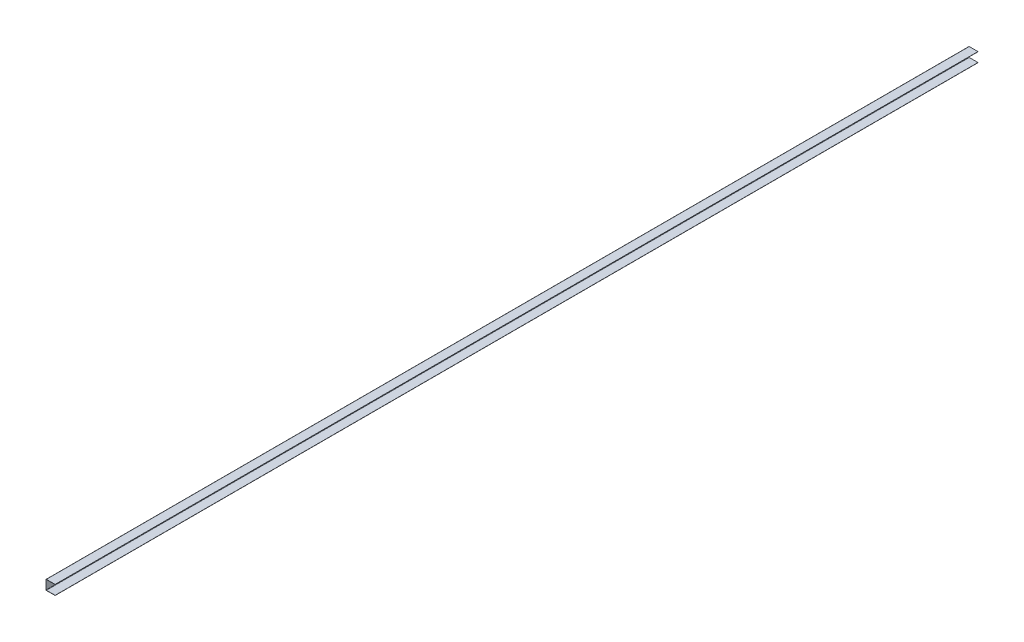
ISO-10303-21;
HEADER;
FILE_DESCRIPTION(('STEP AP214'),'2;1');
FILE_NAME('part.step','',(''),(''),'','','');
FILE_SCHEMA(('AUTOMOTIVE_DESIGN { 1 0 10303 214 1 1 1 1 }'));
ENDSEC;
DATA;
#1=APPLICATION_CONTEXT('core data for automotive mechanical design processes');
#2=APPLICATION_PROTOCOL_DEFINITION('international standard','automotive_design',2000,#1);
#3=PRODUCT_CONTEXT('',#1,'mechanical');
#4=PRODUCT('Part','Part','',(#3));
#5=PRODUCT_RELATED_PRODUCT_CATEGORY('part','',(#4));
#6=PRODUCT_DEFINITION_FORMATION('','',#4);
#7=PRODUCT_DEFINITION_CONTEXT('part definition',#1,'design');
#8=PRODUCT_DEFINITION('design','',#6,#7);
#9=PRODUCT_DEFINITION_SHAPE('','',#8);
#10=(LENGTH_UNIT() NAMED_UNIT(*) SI_UNIT(.MILLI.,.METRE.));
#11=(NAMED_UNIT(*) PLANE_ANGLE_UNIT() SI_UNIT($,.RADIAN.));
#12=(NAMED_UNIT(*) SI_UNIT($,.STERADIAN.) SOLID_ANGLE_UNIT());
#13=UNCERTAINTY_MEASURE_WITH_UNIT(LENGTH_MEASURE(1.E-05),#10,'distance_accuracy_value','');
#14=(GEOMETRIC_REPRESENTATION_CONTEXT(3) GLOBAL_UNCERTAINTY_ASSIGNED_CONTEXT((#13)) GLOBAL_UNIT_ASSIGNED_CONTEXT((#10,
#11,#12)) REPRESENTATION_CONTEXT('',''));
#15=CARTESIAN_POINT('',(0.,0.,0.));
#16=DIRECTION('',(0.,0.,1.));
#17=DIRECTION('',(1.,0.,0.));
#18=AXIS2_PLACEMENT_3D('',#15,#16,#17);
#19=CARTESIAN_POINT('',(0.749999999999994,14.,-2775.));
#20=DIRECTION('',(0.,0.,-1.));
#21=DIRECTION('',(-1.,0.,0.));
#22=AXIS2_PLACEMENT_3D('',#19,#20,#21);
#23=PLANE('',#22);
#24=DIRECTION('',(0.,1.,0.));
#25=VECTOR('',#24,1.);
#26=CARTESIAN_POINT('',(0.749999999999994,14.,-2775.));
#27=LINE('',#26,#25);
#28=CARTESIAN_POINT('',(0.749999999999994,14.,-2775.));
#29=VERTEX_POINT('',#28);
#30=CARTESIAN_POINT('',(0.749999999999993,14.5,-2775.));
#31=VERTEX_POINT('',#30);
#32=EDGE_CURVE('E11',#29,#31,#27,.T.);
#33=ORIENTED_EDGE('',*,*,#32,.F.);
#34=CARTESIAN_POINT('',(0.749999999999994,13.25,-2775.));
#35=DIRECTION('',(0.,0.,-1.));
#36=DIRECTION('',(-1.,0.,0.));
#37=AXIS2_PLACEMENT_3D('',#34,#35,#36);
#38=CIRCLE('',#37,0.75);
#39=CARTESIAN_POINT('',(0.,13.25,-2775.));
#40=VERTEX_POINT('',#39);
#41=EDGE_CURVE('E141',#29,#40,#38,.F.);
#42=ORIENTED_EDGE('',*,*,#41,.T.);
#43=DIRECTION('',(1.,0.,0.));
#44=VECTOR('',#43,1.);
#45=CARTESIAN_POINT('',(-0.500000000000005,13.25,-2775.));
#46=LINE('',#45,#44);
#47=CARTESIAN_POINT('',(-0.500000000000005,13.25,-2775.));
#48=VERTEX_POINT('',#47);
#49=EDGE_CURVE('E45',#48,#40,#46,.T.);
#50=ORIENTED_EDGE('',*,*,#49,.F.);
#51=CARTESIAN_POINT('',(0.749999999999994,13.25,-2775.));
#52=DIRECTION('',(0.,0.,1.));
#53=DIRECTION('',(1.,0.,0.));
#54=AXIS2_PLACEMENT_3D('',#51,#52,#53);
#55=CIRCLE('',#54,1.25);
#56=EDGE_CURVE('E138',#31,#48,#55,.T.);
#57=ORIENTED_EDGE('',*,*,#56,.F.);
#58=EDGE_LOOP('',(#33,#42,#50,#57));
#59=FACE_BOUND('',#58,.T.);
#60=ADVANCED_FACE('F37',(#59),#23,.T.);
#61=CARTESIAN_POINT('',(-0.500000000000005,13.25,-2775.));
#62=DIRECTION('',(0.,0.,-1.));
#63=DIRECTION('',(-1.,0.,0.));
#64=AXIS2_PLACEMENT_3D('',#61,#62,#63);
#65=PLANE('',#64);
#66=DIRECTION('',(-1.,0.,0.));
#67=VECTOR('',#66,1.);
#68=CARTESIAN_POINT('',(27.,14.,-2775.));
#69=LINE('',#68,#67);
#70=CARTESIAN_POINT('',(27.,14.,-2775.));
#71=VERTEX_POINT('',#70);
#72=EDGE_CURVE('E258',#71,#29,#69,.T.);
#73=ORIENTED_EDGE('',*,*,#72,.T.);
#74=ORIENTED_EDGE('',*,*,#32,.T.);
#75=DIRECTION('',(-1.,0.,0.));
#76=VECTOR('',#75,1.);
#77=CARTESIAN_POINT('',(27.,14.5,-2775.));
#78=LINE('',#77,#76);
#79=CARTESIAN_POINT('',(27.,14.5,-2775.));
#80=VERTEX_POINT('',#79);
#81=EDGE_CURVE('E170',#80,#31,#78,.T.);
#82=ORIENTED_EDGE('',*,*,#81,.F.);
#83=DIRECTION('',(0.,-1.,0.));
#84=VECTOR('',#83,1.);
#85=CARTESIAN_POINT('',(27.,14.5,-2775.));
#86=LINE('',#85,#84);
#87=EDGE_CURVE('E172',#80,#71,#86,.T.);
#88=ORIENTED_EDGE('',*,*,#87,.T.);
#89=EDGE_LOOP('',(#73,#74,#82,#88));
#90=FACE_BOUND('',#89,.T.);
#91=ADVANCED_FACE('F269',(#90),#65,.T.);
#92=CARTESIAN_POINT('',(0.,13.25,0.));
#93=DIRECTION('',(0.,0.,1.));
#94=DIRECTION('',(1.,0.,0.));
#95=AXIS2_PLACEMENT_3D('',#92,#93,#94);
#96=PLANE('',#95);
#97=DIRECTION('',(-1.,0.,0.));
#98=VECTOR('',#97,1.);
#99=CARTESIAN_POINT('',(0.,13.25,0.));
#100=LINE('',#99,#98);
#101=CARTESIAN_POINT('',(0.,13.25,0.));
#102=VERTEX_POINT('',#101);
#103=CARTESIAN_POINT('',(-0.500000000000005,13.25,0.));
#104=VERTEX_POINT('',#103);
#105=EDGE_CURVE('E146',#102,#104,#100,.T.);
#106=ORIENTED_EDGE('',*,*,#105,.F.);
#107=CARTESIAN_POINT('',(0.749999999999994,13.25,0.));
#108=DIRECTION('',(0.,0.,-1.));
#109=DIRECTION('',(-1.,0.,0.));
#110=AXIS2_PLACEMENT_3D('',#107,#108,#109);
#111=CIRCLE('',#110,0.75);
#112=CARTESIAN_POINT('',(0.749999999999994,14.,0.));
#113=VERTEX_POINT('',#112);
#114=EDGE_CURVE('E192',#113,#102,#111,.F.);
#115=ORIENTED_EDGE('',*,*,#114,.F.);
#116=DIRECTION('',(0.,-1.,0.));
#117=VECTOR('',#116,1.);
#118=CARTESIAN_POINT('',(0.749999999999993,14.5,0.));
#119=LINE('',#118,#117);
#120=CARTESIAN_POINT('',(0.749999999999993,14.5,0.));
#121=VERTEX_POINT('',#120);
#122=EDGE_CURVE('E238',#121,#113,#119,.T.);
#123=ORIENTED_EDGE('',*,*,#122,.F.);
#124=CARTESIAN_POINT('',(0.749999999999994,13.25,0.));
#125=DIRECTION('',(0.,0.,1.));
#126=DIRECTION('',(1.,0.,0.));
#127=AXIS2_PLACEMENT_3D('',#124,#125,#126);
#128=CIRCLE('',#127,1.25);
#129=EDGE_CURVE('E203',#121,#104,#128,.T.);
#130=ORIENTED_EDGE('',*,*,#129,.T.);
#131=EDGE_LOOP('',(#106,#115,#123,#130));
#132=FACE_BOUND('',#131,.T.);
#133=ADVANCED_FACE('F246',(#132),#96,.T.);
#134=CARTESIAN_POINT('',(0.749999999999993,14.5,0.));
#135=DIRECTION('',(0.,0.,1.));
#136=DIRECTION('',(1.,0.,0.));
#137=AXIS2_PLACEMENT_3D('',#134,#135,#136);
#138=PLANE('',#137);
#139=DIRECTION('',(0.,-1.,0.));
#140=VECTOR('',#139,1.);
#141=CARTESIAN_POINT('',(0.,14.,0.));
#142=LINE('',#141,#140);
#143=CARTESIAN_POINT('',(0.,-13.25,0.));
#144=VERTEX_POINT('',#143);
#145=EDGE_CURVE('E189',#102,#144,#142,.T.);
#146=ORIENTED_EDGE('',*,*,#145,.F.);
#147=ORIENTED_EDGE('',*,*,#105,.T.);
#148=DIRECTION('',(0.,-1.,0.));
#149=VECTOR('',#148,1.);
#150=CARTESIAN_POINT('',(-0.500000000000005,14.,0.));
#151=LINE('',#150,#149);
#152=CARTESIAN_POINT('',(-0.499999999999997,-13.25,0.));
#153=VERTEX_POINT('',#152);
#154=EDGE_CURVE('E155',#104,#153,#151,.T.);
#155=ORIENTED_EDGE('',*,*,#154,.T.);
#156=DIRECTION('',(1.,0.,0.));
#157=VECTOR('',#156,1.);
#158=CARTESIAN_POINT('',(-0.499999999999997,-13.25,0.));
#159=LINE('',#158,#157);
#160=EDGE_CURVE('E94',#153,#144,#159,.T.);
#161=ORIENTED_EDGE('',*,*,#160,.T.);
#162=EDGE_LOOP('',(#146,#147,#155,#161));
#163=FACE_BOUND('',#162,.T.);
#164=ADVANCED_FACE('F242',(#163),#138,.T.);
#165=CARTESIAN_POINT('',(0.,-13.25,-2775.));
#166=DIRECTION('',(0.,0.,-1.));
#167=DIRECTION('',(-1.,0.,0.));
#168=AXIS2_PLACEMENT_3D('',#165,#166,#167);
#169=PLANE('',#168);
#170=DIRECTION('',(-1.,0.,0.));
#171=VECTOR('',#170,1.);
#172=CARTESIAN_POINT('',(0.,-13.25,-2775.));
#173=LINE('',#172,#171);
#174=CARTESIAN_POINT('',(0.,-13.25,-2775.));
#175=VERTEX_POINT('',#174);
#176=CARTESIAN_POINT('',(-0.499999999999997,-13.25,-2775.));
#177=VERTEX_POINT('',#176);
#178=EDGE_CURVE('E163',#175,#177,#173,.T.);
#179=ORIENTED_EDGE('',*,*,#178,.F.);
#180=CARTESIAN_POINT('',(0.750000000000003,-13.25,-2775.));
#181=DIRECTION('',(0.,0.,-1.));
#182=DIRECTION('',(-1.,0.,0.));
#183=AXIS2_PLACEMENT_3D('',#180,#181,#182);
#184=CIRCLE('',#183,0.75);
#185=CARTESIAN_POINT('',(0.750000000000004,-14.,-2775.));
#186=VERTEX_POINT('',#185);
#187=EDGE_CURVE('E256',#175,#186,#184,.F.);
#188=ORIENTED_EDGE('',*,*,#187,.T.);
#189=DIRECTION('',(0.,1.,0.));
#190=VECTOR('',#189,1.);
#191=CARTESIAN_POINT('',(0.750000000000004,-14.5,-2775.));
#192=LINE('',#191,#190);
#193=CARTESIAN_POINT('',(0.750000000000004,-14.5,-2775.));
#194=VERTEX_POINT('',#193);
#195=EDGE_CURVE('E53',#194,#186,#192,.T.);
#196=ORIENTED_EDGE('',*,*,#195,.F.);
#197=CARTESIAN_POINT('',(0.750000000000003,-13.25,-2775.));
#198=DIRECTION('',(0.,0.,1.));
#199=DIRECTION('',(1.,0.,0.));
#200=AXIS2_PLACEMENT_3D('',#197,#198,#199);
#201=CIRCLE('',#200,1.25);
#202=EDGE_CURVE('E165',#177,#194,#201,.T.);
#203=ORIENTED_EDGE('',*,*,#202,.F.);
#204=EDGE_LOOP('',(#179,#188,#196,#203));
#205=FACE_BOUND('',#204,.T.);
#206=ADVANCED_FACE('F301',(#205),#169,.T.);
#207=CARTESIAN_POINT('',(0.750000000000004,-14.5,-2775.));
#208=DIRECTION('',(0.,0.,-1.));
#209=DIRECTION('',(-1.,0.,0.));
#210=AXIS2_PLACEMENT_3D('',#207,#208,#209);
#211=PLANE('',#210);
#212=DIRECTION('',(0.,-1.,0.));
#213=VECTOR('',#212,1.);
#214=CARTESIAN_POINT('',(0.,14.,-2775.));
#215=LINE('',#214,#213);
#216=EDGE_CURVE('E254',#40,#175,#215,.T.);
#217=ORIENTED_EDGE('',*,*,#216,.T.);
#218=ORIENTED_EDGE('',*,*,#178,.T.);
#219=DIRECTION('',(0.,-1.,0.));
#220=VECTOR('',#219,1.);
#221=CARTESIAN_POINT('',(-0.500000000000005,14.,-2775.));
#222=LINE('',#221,#220);
#223=EDGE_CURVE('E153',#48,#177,#222,.T.);
#224=ORIENTED_EDGE('',*,*,#223,.F.);
#225=ORIENTED_EDGE('',*,*,#49,.T.);
#226=EDGE_LOOP('',(#217,#218,#224,#225));
#227=FACE_BOUND('',#226,.T.);
#228=ADVANCED_FACE('F162',(#227),#211,.T.);
#229=CARTESIAN_POINT('',(0.750000000000004,-14.,0.));
#230=DIRECTION('',(0.,0.,1.));
#231=DIRECTION('',(1.,0.,0.));
#232=AXIS2_PLACEMENT_3D('',#229,#230,#231);
#233=PLANE('',#232);
#234=DIRECTION('',(0.,-1.,0.));
#235=VECTOR('',#234,1.);
#236=CARTESIAN_POINT('',(0.750000000000004,-14.,0.));
#237=LINE('',#236,#235);
#238=CARTESIAN_POINT('',(0.750000000000004,-14.,0.));
#239=VERTEX_POINT('',#238);
#240=CARTESIAN_POINT('',(0.750000000000004,-14.5,0.));
#241=VERTEX_POINT('',#240);
#242=EDGE_CURVE('E101',#239,#241,#237,.T.);
#243=ORIENTED_EDGE('',*,*,#242,.F.);
#244=CARTESIAN_POINT('',(0.750000000000003,-13.25,0.));
#245=DIRECTION('',(0.,0.,-1.));
#246=DIRECTION('',(-1.,0.,0.));
#247=AXIS2_PLACEMENT_3D('',#244,#245,#246);
#248=CIRCLE('',#247,0.75);
#249=EDGE_CURVE('E186',#144,#239,#248,.F.);
#250=ORIENTED_EDGE('',*,*,#249,.F.);
#251=ORIENTED_EDGE('',*,*,#160,.F.);
#252=CARTESIAN_POINT('',(0.750000000000003,-13.25,0.));
#253=DIRECTION('',(0.,0.,1.));
#254=DIRECTION('',(1.,0.,0.));
#255=AXIS2_PLACEMENT_3D('',#252,#253,#254);
#256=CIRCLE('',#255,1.25);
#257=EDGE_CURVE('E206',#153,#241,#256,.T.);
#258=ORIENTED_EDGE('',*,*,#257,.T.);
#259=EDGE_LOOP('',(#243,#250,#251,#258));
#260=FACE_BOUND('',#259,.T.);
#261=ADVANCED_FACE('F306',(#260),#233,.T.);
#262=CARTESIAN_POINT('',(-0.499999999999997,-13.25,0.));
#263=DIRECTION('',(0.,0.,1.));
#264=DIRECTION('',(1.,0.,0.));
#265=AXIS2_PLACEMENT_3D('',#262,#263,#264);
#266=PLANE('',#265);
#267=DIRECTION('',(1.,0.,0.));
#268=VECTOR('',#267,1.);
#269=CARTESIAN_POINT('',(0.,-14.,0.));
#270=LINE('',#269,#268);
#271=CARTESIAN_POINT('',(27.,-14.,0.));
#272=VERTEX_POINT('',#271);
#273=EDGE_CURVE('E184',#239,#272,#270,.T.);
#274=ORIENTED_EDGE('',*,*,#273,.F.);
#275=ORIENTED_EDGE('',*,*,#242,.T.);
#276=DIRECTION('',(1.,0.,0.));
#277=VECTOR('',#276,1.);
#278=CARTESIAN_POINT('',(0.,-14.5,0.));
#279=LINE('',#278,#277);
#280=CARTESIAN_POINT('',(27.,-14.5,0.));
#281=VERTEX_POINT('',#280);
#282=EDGE_CURVE('E179',#241,#281,#279,.T.);
#283=ORIENTED_EDGE('',*,*,#282,.T.);
#284=DIRECTION('',(0.,-1.,0.));
#285=VECTOR('',#284,1.);
#286=CARTESIAN_POINT('',(27.,-14.,0.));
#287=LINE('',#286,#285);
#288=EDGE_CURVE('E181',#272,#281,#287,.T.);
#289=ORIENTED_EDGE('',*,*,#288,.F.);
#290=EDGE_LOOP('',(#274,#275,#283,#289));
#291=FACE_BOUND('',#290,.T.);
#292=ADVANCED_FACE('F309',(#291),#266,.T.);
#293=CARTESIAN_POINT('',(0.,-14.5,-2775.));
#294=DIRECTION('',(0.,-1.,0.));
#295=DIRECTION('',(1.,0.,0.));
#296=AXIS2_PLACEMENT_3D('',#293,#294,#295);
#297=PLANE('',#296);
#298=ORIENTED_EDGE('',*,*,#282,.F.);
#299=DIRECTION('',(0.,0.,1.));
#300=VECTOR('',#299,1.);
#301=CARTESIAN_POINT('',(0.750000000000004,-14.5,-2775.));
#302=LINE('',#301,#300);
#303=EDGE_CURVE('E209',#194,#241,#302,.T.);
#304=ORIENTED_EDGE('',*,*,#303,.F.);
#305=DIRECTION('',(1.,0.,0.));
#306=VECTOR('',#305,1.);
#307=CARTESIAN_POINT('',(0.,-14.5,-2775.));
#308=LINE('',#307,#306);
#309=CARTESIAN_POINT('',(27.,-14.5,-2775.));
#310=VERTEX_POINT('',#309);
#311=EDGE_CURVE('E208',#194,#310,#308,.T.);
#312=ORIENTED_EDGE('',*,*,#311,.T.);
#313=DIRECTION('',(0.,0.,1.));
#314=VECTOR('',#313,1.);
#315=CARTESIAN_POINT('',(27.,-14.5,-2775.));
#316=LINE('',#315,#314);
#317=EDGE_CURVE('E178',#310,#281,#316,.T.);
#318=ORIENTED_EDGE('',*,*,#317,.T.);
#319=EDGE_LOOP('',(#298,#304,#312,#318));
#320=FACE_BOUND('',#319,.T.);
#321=ADVANCED_FACE('F312',(#320),#297,.T.);
#322=CARTESIAN_POINT('',(0.750000000000003,-13.25,-2775.));
#323=DIRECTION('',(0.,0.,1.));
#324=DIRECTION('',(1.,0.,0.));
#325=AXIS2_PLACEMENT_3D('',#322,#323,#324);
#326=CYLINDRICAL_SURFACE('',#325,1.25);
#327=ORIENTED_EDGE('',*,*,#257,.F.);
#328=DIRECTION('',(0.,0.,1.));
#329=VECTOR('',#328,1.);
#330=CARTESIAN_POINT('',(-0.499999999999997,-13.25,-2775.));
#331=LINE('',#330,#329);
#332=EDGE_CURVE('E159',#177,#153,#331,.T.);
#333=ORIENTED_EDGE('',*,*,#332,.F.);
#334=ORIENTED_EDGE('',*,*,#202,.T.);
#335=ORIENTED_EDGE('',*,*,#303,.T.);
#336=EDGE_LOOP('',(#327,#333,#334,#335));
#337=FACE_BOUND('',#336,.T.);
#338=ADVANCED_FACE('F315',(#337),#326,.T.);
#339=CARTESIAN_POINT('',(-0.500000000000005,14.,-2775.));
#340=DIRECTION('',(-1.,0.,0.));
#341=DIRECTION('',(0.,-1.,0.));
#342=AXIS2_PLACEMENT_3D('',#339,#340,#341);
#343=PLANE('',#342);
#344=ORIENTED_EDGE('',*,*,#154,.F.);
#345=DIRECTION('',(0.,0.,1.));
#346=VECTOR('',#345,1.);
#347=CARTESIAN_POINT('',(-0.500000000000005,13.25,-2775.));
#348=LINE('',#347,#346);
#349=EDGE_CURVE('E151',#48,#104,#348,.T.);
#350=ORIENTED_EDGE('',*,*,#349,.F.);
#351=ORIENTED_EDGE('',*,*,#223,.T.);
#352=ORIENTED_EDGE('',*,*,#332,.T.);
#353=EDGE_LOOP('',(#344,#350,#351,#352));
#354=FACE_BOUND('',#353,.T.);
#355=ADVANCED_FACE('F152',(#354),#343,.T.);
#356=CARTESIAN_POINT('',(0.749999999999994,13.25,-2775.));
#357=DIRECTION('',(0.,0.,1.));
#358=DIRECTION('',(1.,0.,0.));
#359=AXIS2_PLACEMENT_3D('',#356,#357,#358);
#360=CYLINDRICAL_SURFACE('',#359,1.25);
#361=ORIENTED_EDGE('',*,*,#129,.F.);
#362=DIRECTION('',(0.,0.,1.));
#363=VECTOR('',#362,1.);
#364=CARTESIAN_POINT('',(0.749999999999993,14.5,-2775.));
#365=LINE('',#364,#363);
#366=EDGE_CURVE('E160',#31,#121,#365,.T.);
#367=ORIENTED_EDGE('',*,*,#366,.F.);
#368=ORIENTED_EDGE('',*,*,#56,.T.);
#369=ORIENTED_EDGE('',*,*,#349,.T.);
#370=EDGE_LOOP('',(#361,#367,#368,#369));
#371=FACE_BOUND('',#370,.T.);
#372=ADVANCED_FACE('F168',(#371),#360,.T.);
#373=CARTESIAN_POINT('',(27.,14.5,-2775.));
#374=DIRECTION('',(0.,1.,0.));
#375=DIRECTION('',(-1.,0.,0.));
#376=AXIS2_PLACEMENT_3D('',#373,#374,#375);
#377=PLANE('',#376);
#378=DIRECTION('',(-1.,0.,0.));
#379=VECTOR('',#378,1.);
#380=CARTESIAN_POINT('',(27.,14.5,0.));
#381=LINE('',#380,#379);
#382=CARTESIAN_POINT('',(27.,14.5,0.));
#383=VERTEX_POINT('',#382);
#384=EDGE_CURVE('E200',#383,#121,#381,.T.);
#385=ORIENTED_EDGE('',*,*,#384,.F.);
#386=DIRECTION('',(0.,0.,1.));
#387=VECTOR('',#386,1.);
#388=CARTESIAN_POINT('',(27.,14.5,-2775.));
#389=LINE('',#388,#387);
#390=EDGE_CURVE('E213',#80,#383,#389,.T.);
#391=ORIENTED_EDGE('',*,*,#390,.F.);
#392=ORIENTED_EDGE('',*,*,#81,.T.);
#393=ORIENTED_EDGE('',*,*,#366,.T.);
#394=EDGE_LOOP('',(#385,#391,#392,#393));
#395=FACE_BOUND('',#394,.T.);
#396=ADVANCED_FACE('F281',(#395),#377,.T.);
#397=CARTESIAN_POINT('',(27.,14.5,-2775.));
#398=DIRECTION('',(-1.,0.,0.));
#399=DIRECTION('',(0.,0.,1.));
#400=AXIS2_PLACEMENT_3D('',#397,#398,#399);
#401=PLANE('',#400);
#402=DIRECTION('',(0.,-1.,0.));
#403=VECTOR('',#402,1.);
#404=CARTESIAN_POINT('',(27.,14.5,0.));
#405=LINE('',#404,#403);
#406=CARTESIAN_POINT('',(27.,14.,0.));
#407=VERTEX_POINT('',#406);
#408=EDGE_CURVE('E198',#383,#407,#405,.T.);
#409=ORIENTED_EDGE('',*,*,#408,.T.);
#410=DIRECTION('',(0.,0.,1.));
#411=VECTOR('',#410,1.);
#412=CARTESIAN_POINT('',(27.,14.,-2775.));
#413=LINE('',#412,#411);
#414=EDGE_CURVE('E215',#71,#407,#413,.T.);
#415=ORIENTED_EDGE('',*,*,#414,.F.);
#416=ORIENTED_EDGE('',*,*,#87,.F.);
#417=ORIENTED_EDGE('',*,*,#390,.T.);
#418=EDGE_LOOP('',(#409,#415,#416,#417));
#419=FACE_BOUND('',#418,.T.);
#420=ADVANCED_FACE('F272',(#419),#401,.F.);
#421=CARTESIAN_POINT('',(27.,14.,-2775.));
#422=DIRECTION('',(0.,1.,0.));
#423=DIRECTION('',(-1.,0.,0.));
#424=AXIS2_PLACEMENT_3D('',#421,#422,#423);
#425=PLANE('',#424);
#426=DIRECTION('',(-1.,0.,0.));
#427=VECTOR('',#426,1.);
#428=CARTESIAN_POINT('',(27.,14.,0.));
#429=LINE('',#428,#427);
#430=EDGE_CURVE('E195',#407,#113,#429,.T.);
#431=ORIENTED_EDGE('',*,*,#430,.T.);
#432=DIRECTION('',(0.,0.,1.));
#433=VECTOR('',#432,1.);
#434=CARTESIAN_POINT('',(0.749999999999994,14.,-2775.));
#435=LINE('',#434,#433);
#436=EDGE_CURVE('E218',#29,#113,#435,.T.);
#437=ORIENTED_EDGE('',*,*,#436,.F.);
#438=ORIENTED_EDGE('',*,*,#72,.F.);
#439=ORIENTED_EDGE('',*,*,#414,.T.);
#440=EDGE_LOOP('',(#431,#437,#438,#439));
#441=FACE_BOUND('',#440,.T.);
#442=ADVANCED_FACE('F276',(#441),#425,.F.);
#443=CARTESIAN_POINT('',(0.749999999999994,13.25,-2775.));
#444=DIRECTION('',(0.,0.,1.));
#445=DIRECTION('',(1.,0.,0.));
#446=AXIS2_PLACEMENT_3D('',#443,#444,#445);
#447=CYLINDRICAL_SURFACE('',#446,0.75);
#448=ORIENTED_EDGE('',*,*,#114,.T.);
#449=DIRECTION('',(0.,0.,1.));
#450=VECTOR('',#449,1.);
#451=CARTESIAN_POINT('',(0.,13.25,-2775.));
#452=LINE('',#451,#450);
#453=EDGE_CURVE('E221',#40,#102,#452,.T.);
#454=ORIENTED_EDGE('',*,*,#453,.F.);
#455=ORIENTED_EDGE('',*,*,#41,.F.);
#456=ORIENTED_EDGE('',*,*,#436,.T.);
#457=EDGE_LOOP('',(#448,#454,#455,#456));
#458=FACE_BOUND('',#457,.T.);
#459=ADVANCED_FACE('F248',(#458),#447,.F.);
#460=CARTESIAN_POINT('',(0.,14.,-2775.));
#461=DIRECTION('',(-1.,0.,0.));
#462=DIRECTION('',(0.,-1.,0.));
#463=AXIS2_PLACEMENT_3D('',#460,#461,#462);
#464=PLANE('',#463);
#465=ORIENTED_EDGE('',*,*,#145,.T.);
#466=DIRECTION('',(0.,0.,1.));
#467=VECTOR('',#466,1.);
#468=CARTESIAN_POINT('',(0.,-13.25,-2775.));
#469=LINE('',#468,#467);
#470=EDGE_CURVE('E224',#175,#144,#469,.T.);
#471=ORIENTED_EDGE('',*,*,#470,.F.);
#472=ORIENTED_EDGE('',*,*,#216,.F.);
#473=ORIENTED_EDGE('',*,*,#453,.T.);
#474=EDGE_LOOP('',(#465,#471,#472,#473));
#475=FACE_BOUND('',#474,.T.);
#476=ADVANCED_FACE('F252',(#475),#464,.F.);
#477=CARTESIAN_POINT('',(0.750000000000003,-13.25,-2775.));
#478=DIRECTION('',(0.,0.,1.));
#479=DIRECTION('',(1.,0.,0.));
#480=AXIS2_PLACEMENT_3D('',#477,#478,#479);
#481=CYLINDRICAL_SURFACE('',#480,0.75);
#482=ORIENTED_EDGE('',*,*,#249,.T.);
#483=DIRECTION('',(0.,0.,1.));
#484=VECTOR('',#483,1.);
#485=CARTESIAN_POINT('',(0.750000000000004,-14.,-2775.));
#486=LINE('',#485,#484);
#487=EDGE_CURVE('E227',#186,#239,#486,.T.);
#488=ORIENTED_EDGE('',*,*,#487,.F.);
#489=ORIENTED_EDGE('',*,*,#187,.F.);
#490=ORIENTED_EDGE('',*,*,#470,.T.);
#491=EDGE_LOOP('',(#482,#488,#489,#490));
#492=FACE_BOUND('',#491,.T.);
#493=ADVANCED_FACE('F325',(#492),#481,.F.);
#494=CARTESIAN_POINT('',(0.,-14.,-2775.));
#495=DIRECTION('',(0.,-1.,0.));
#496=DIRECTION('',(1.,0.,0.));
#497=AXIS2_PLACEMENT_3D('',#494,#495,#496);
#498=PLANE('',#497);
#499=ORIENTED_EDGE('',*,*,#273,.T.);
#500=DIRECTION('',(0.,0.,1.));
#501=VECTOR('',#500,1.);
#502=CARTESIAN_POINT('',(27.,-14.,-2775.));
#503=LINE('',#502,#501);
#504=CARTESIAN_POINT('',(27.,-14.,-2775.));
#505=VERTEX_POINT('',#504);
#506=EDGE_CURVE('E230',#505,#272,#503,.T.);
#507=ORIENTED_EDGE('',*,*,#506,.F.);
#508=DIRECTION('',(1.,0.,0.));
#509=VECTOR('',#508,1.);
#510=CARTESIAN_POINT('',(0.,-14.,-2775.));
#511=LINE('',#510,#509);
#512=EDGE_CURVE('E260',#186,#505,#511,.T.);
#513=ORIENTED_EDGE('',*,*,#512,.F.);
#514=ORIENTED_EDGE('',*,*,#487,.T.);
#515=EDGE_LOOP('',(#499,#507,#513,#514));
#516=FACE_BOUND('',#515,.T.);
#517=ADVANCED_FACE('F321',(#516),#498,.F.);
#518=CARTESIAN_POINT('',(27.,-14.,-2775.));
#519=DIRECTION('',(-1.,0.,0.));
#520=DIRECTION('',(0.,0.,1.));
#521=AXIS2_PLACEMENT_3D('',#518,#519,#520);
#522=PLANE('',#521);
#523=ORIENTED_EDGE('',*,*,#288,.T.);
#524=ORIENTED_EDGE('',*,*,#317,.F.);
#525=DIRECTION('',(0.,-1.,0.));
#526=VECTOR('',#525,1.);
#527=CARTESIAN_POINT('',(27.,-14.,-2775.));
#528=LINE('',#527,#526);
#529=EDGE_CURVE('E110',#505,#310,#528,.T.);
#530=ORIENTED_EDGE('',*,*,#529,.F.);
#531=ORIENTED_EDGE('',*,*,#506,.T.);
#532=EDGE_LOOP('',(#523,#524,#530,#531));
#533=FACE_BOUND('',#532,.T.);
#534=ADVANCED_FACE('F317',(#533),#522,.F.);
#535=CARTESIAN_POINT('',(0.750000000000003,-13.25,-2775.));
#536=DIRECTION('',(0.,0.,-1.));
#537=DIRECTION('',(-1.,0.,0.));
#538=AXIS2_PLACEMENT_3D('',#535,#536,#537);
#539=PLANE('',#538);
#540=ORIENTED_EDGE('',*,*,#311,.F.);
#541=ORIENTED_EDGE('',*,*,#195,.T.);
#542=ORIENTED_EDGE('',*,*,#512,.T.);
#543=ORIENTED_EDGE('',*,*,#529,.T.);
#544=EDGE_LOOP('',(#540,#541,#542,#543));
#545=FACE_BOUND('',#544,.T.);
#546=ADVANCED_FACE('F320',(#545),#539,.T.);
#547=CARTESIAN_POINT('',(0.750000000000003,-13.25,0.));
#548=DIRECTION('',(0.,0.,-1.));
#549=DIRECTION('',(-1.,0.,0.));
#550=AXIS2_PLACEMENT_3D('',#547,#548,#549);
#551=PLANE('',#550);
#552=ORIENTED_EDGE('',*,*,#384,.T.);
#553=ORIENTED_EDGE('',*,*,#122,.T.);
#554=ORIENTED_EDGE('',*,*,#430,.F.);
#555=ORIENTED_EDGE('',*,*,#408,.F.);
#556=EDGE_LOOP('',(#552,#553,#554,#555));
#557=FACE_BOUND('',#556,.T.);
#558=ADVANCED_FACE('F278',(#557),#551,.F.);
#559=CLOSED_SHELL('',(#60,#91,#133,#164,#206,#228,#261,#292,#321,#338,#355,#372,#396,#420,#442,
#459,#476,#493,#517,#534,#546,#558));
#560=MANIFOLD_SOLID_BREP('B2',#559);
#561=ADVANCED_BREP_SHAPE_REPRESENTATION('',(#18,#560),#14);
#562=SHAPE_DEFINITION_REPRESENTATION(#9,#561);
ENDSEC;
END-ISO-10303-21;
